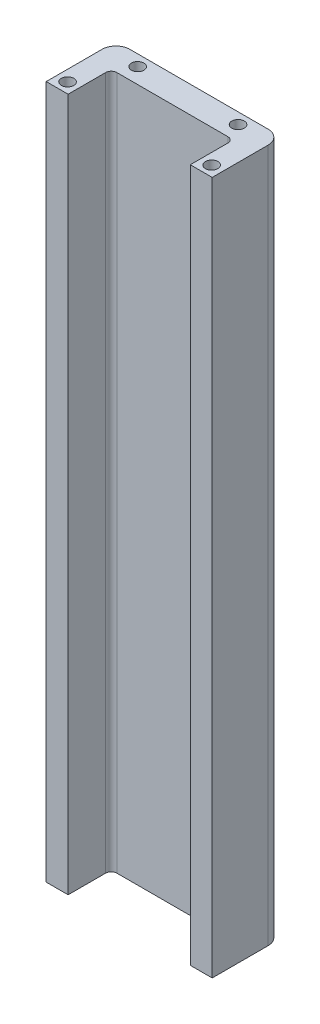
ISO-10303-21;
HEADER;
FILE_DESCRIPTION(('STEP AP214'),'2;1');
FILE_NAME('part.step','',(''),(''),'','','');
FILE_SCHEMA(('AUTOMOTIVE_DESIGN { 1 0 10303 214 1 1 1 1 }'));
ENDSEC;
DATA;
#1=APPLICATION_CONTEXT('core data for automotive mechanical design processes');
#2=APPLICATION_PROTOCOL_DEFINITION('international standard','automotive_design',2000,#1);
#3=PRODUCT_CONTEXT('',#1,'mechanical');
#4=PRODUCT('Part','Part','',(#3));
#5=PRODUCT_RELATED_PRODUCT_CATEGORY('part','',(#4));
#6=PRODUCT_DEFINITION_FORMATION('','',#4);
#7=PRODUCT_DEFINITION_CONTEXT('part definition',#1,'design');
#8=PRODUCT_DEFINITION('design','',#6,#7);
#9=PRODUCT_DEFINITION_SHAPE('','',#8);
#10=(LENGTH_UNIT() NAMED_UNIT(*) SI_UNIT(.MILLI.,.METRE.));
#11=(NAMED_UNIT(*) PLANE_ANGLE_UNIT() SI_UNIT($,.RADIAN.));
#12=(NAMED_UNIT(*) SI_UNIT($,.STERADIAN.) SOLID_ANGLE_UNIT());
#13=UNCERTAINTY_MEASURE_WITH_UNIT(LENGTH_MEASURE(1.E-05),#10,'distance_accuracy_value','');
#14=(GEOMETRIC_REPRESENTATION_CONTEXT(3) GLOBAL_UNCERTAINTY_ASSIGNED_CONTEXT((#13)) GLOBAL_UNIT_ASSIGNED_CONTEXT((#10,
#11,#12)) REPRESENTATION_CONTEXT('',''));
#15=CARTESIAN_POINT('',(0.,0.,0.));
#16=DIRECTION('',(0.,0.,1.));
#17=DIRECTION('',(1.,0.,0.));
#18=AXIS2_PLACEMENT_3D('',#15,#16,#17);
#19=CARTESIAN_POINT('',(29.925,-250.,12.575));
#20=DIRECTION('',(1.,0.,0.));
#21=DIRECTION('',(0.,0.,-1.));
#22=AXIS2_PLACEMENT_3D('',#19,#20,#21);
#23=PLANE('',#22);
#24=DIRECTION('',(0.,0.,-1.));
#25=VECTOR('',#24,1.);
#26=CARTESIAN_POINT('',(29.925,0.,12.575));
#27=LINE('',#26,#25);
#28=CARTESIAN_POINT('',(29.925,0.,12.575));
#29=VERTEX_POINT('',#28);
#30=CARTESIAN_POINT('',(29.925,0.,-7.57499999999996));
#31=VERTEX_POINT('',#30);
#32=EDGE_CURVE('E166',#29,#31,#27,.T.);
#33=ORIENTED_EDGE('',*,*,#32,.F.);
#34=DIRECTION('',(0.,1.,0.));
#35=VECTOR('',#34,1.);
#36=CARTESIAN_POINT('',(29.925,-250.,12.575));
#37=LINE('',#36,#35);
#38=CARTESIAN_POINT('',(29.925,-250.,12.575));
#39=VERTEX_POINT('',#38);
#40=EDGE_CURVE('E11',#39,#29,#37,.T.);
#41=ORIENTED_EDGE('',*,*,#40,.F.);
#42=DIRECTION('',(0.,0.,-1.));
#43=VECTOR('',#42,1.);
#44=CARTESIAN_POINT('',(29.925,-250.,12.575));
#45=LINE('',#44,#43);
#46=CARTESIAN_POINT('',(29.925,-250.,-7.57499999999996));
#47=VERTEX_POINT('',#46);
#48=EDGE_CURVE('E211',#39,#47,#45,.T.);
#49=ORIENTED_EDGE('',*,*,#48,.T.);
#50=DIRECTION('',(0.,1.,0.));
#51=VECTOR('',#50,1.);
#52=CARTESIAN_POINT('',(29.925,-250.,-7.57499999999996));
#53=LINE('',#52,#51);
#54=EDGE_CURVE('E42',#47,#31,#53,.T.);
#55=ORIENTED_EDGE('',*,*,#54,.T.);
#56=EDGE_LOOP('',(#33,#41,#49,#55));
#57=FACE_BOUND('',#56,.T.);
#58=ADVANCED_FACE('F39',(#57),#23,.T.);
#59=CARTESIAN_POINT('',(29.925,-250.,12.575));
#60=DIRECTION('',(0.,0.,1.));
#61=DIRECTION('',(1.,0.,0.));
#62=AXIS2_PLACEMENT_3D('',#59,#60,#61);
#63=PLANE('',#62);
#64=DIRECTION('',(1.,0.,0.));
#65=VECTOR('',#64,1.);
#66=CARTESIAN_POINT('',(29.925,0.,12.575));
#67=LINE('',#66,#65);
#68=CARTESIAN_POINT('',(22.025,0.,12.575));
#69=VERTEX_POINT('',#68);
#70=EDGE_CURVE('E208',#69,#29,#67,.T.);
#71=ORIENTED_EDGE('',*,*,#70,.F.);
#72=DIRECTION('',(0.,1.,0.));
#73=VECTOR('',#72,1.);
#74=CARTESIAN_POINT('',(22.025,-250.,12.575));
#75=LINE('',#74,#73);
#76=CARTESIAN_POINT('',(22.025,-250.,12.575));
#77=VERTEX_POINT('',#76);
#78=EDGE_CURVE('E49',#77,#69,#75,.T.);
#79=ORIENTED_EDGE('',*,*,#78,.F.);
#80=DIRECTION('',(1.,0.,0.));
#81=VECTOR('',#80,1.);
#82=CARTESIAN_POINT('',(29.925,-250.,12.575));
#83=LINE('',#82,#81);
#84=EDGE_CURVE('E152',#77,#39,#83,.T.);
#85=ORIENTED_EDGE('',*,*,#84,.T.);
#86=ORIENTED_EDGE('',*,*,#40,.T.);
#87=EDGE_LOOP('',(#71,#79,#85,#86));
#88=FACE_BOUND('',#87,.T.);
#89=ADVANCED_FACE('F241',(#88),#63,.T.);
#90=CARTESIAN_POINT('',(22.025,-250.,-0.974999999999997));
#91=DIRECTION('',(-1.,0.,0.));
#92=DIRECTION('',(0.,0.,1.));
#93=AXIS2_PLACEMENT_3D('',#90,#91,#92);
#94=PLANE('',#93);
#95=DIRECTION('',(0.,0.,1.));
#96=VECTOR('',#95,1.);
#97=CARTESIAN_POINT('',(22.025,0.,-0.974999999999997));
#98=LINE('',#97,#96);
#99=CARTESIAN_POINT('',(22.025,0.,-0.974999999999997));
#100=VERTEX_POINT('',#99);
#101=EDGE_CURVE('E138',#100,#69,#98,.T.);
#102=ORIENTED_EDGE('',*,*,#101,.F.);
#103=DIRECTION('',(0.,1.,0.));
#104=VECTOR('',#103,1.);
#105=CARTESIAN_POINT('',(22.025,-250.,-0.974999999999997));
#106=LINE('',#105,#104);
#107=CARTESIAN_POINT('',(22.025,-250.,-0.974999999999997));
#108=VERTEX_POINT('',#107);
#109=EDGE_CURVE('E133',#108,#100,#106,.T.);
#110=ORIENTED_EDGE('',*,*,#109,.F.);
#111=DIRECTION('',(0.,0.,1.));
#112=VECTOR('',#111,1.);
#113=CARTESIAN_POINT('',(22.025,-250.,-0.974999999999997));
#114=LINE('',#113,#112);
#115=EDGE_CURVE('E136',#108,#77,#114,.T.);
#116=ORIENTED_EDGE('',*,*,#115,.T.);
#117=ORIENTED_EDGE('',*,*,#78,.T.);
#118=EDGE_LOOP('',(#102,#110,#116,#117));
#119=FACE_BOUND('',#118,.T.);
#120=ADVANCED_FACE('F135',(#119),#94,.T.);
#121=CARTESIAN_POINT('',(20.025,-250.,-0.974999999999997));
#122=DIRECTION('',(0.,1.,0.));
#123=DIRECTION('',(0.,0.,1.));
#124=AXIS2_PLACEMENT_3D('',#121,#122,#123);
#125=CYLINDRICAL_SURFACE('',#124,2.);
#126=CARTESIAN_POINT('',(20.025,0.,-0.974999999999997));
#127=DIRECTION('',(0.,-1.,0.));
#128=DIRECTION('',(0.,0.,1.));
#129=AXIS2_PLACEMENT_3D('',#126,#127,#128);
#130=CIRCLE('',#129,2.);
#131=CARTESIAN_POINT('',(20.025,0.,-2.975));
#132=VERTEX_POINT('',#131);
#133=EDGE_CURVE('E203',#132,#100,#130,.T.);
#134=ORIENTED_EDGE('',*,*,#133,.F.);
#135=DIRECTION('',(0.,1.,0.));
#136=VECTOR('',#135,1.);
#137=CARTESIAN_POINT('',(20.025,-250.,-2.975));
#138=LINE('',#137,#136);
#139=CARTESIAN_POINT('',(20.025,-250.,-2.975));
#140=VERTEX_POINT('',#139);
#141=EDGE_CURVE('E144',#140,#132,#138,.T.);
#142=ORIENTED_EDGE('',*,*,#141,.F.);
#143=CARTESIAN_POINT('',(20.025,-250.,-0.974999999999997));
#144=DIRECTION('',(0.,-1.,0.));
#145=DIRECTION('',(0.,0.,1.));
#146=AXIS2_PLACEMENT_3D('',#143,#144,#145);
#147=CIRCLE('',#146,2.);
#148=EDGE_CURVE('E150',#140,#108,#147,.T.);
#149=ORIENTED_EDGE('',*,*,#148,.T.);
#150=ORIENTED_EDGE('',*,*,#109,.T.);
#151=EDGE_LOOP('',(#134,#142,#149,#150));
#152=FACE_BOUND('',#151,.T.);
#153=ADVANCED_FACE('F155',(#152),#125,.F.);
#154=CARTESIAN_POINT('',(-20.025,-250.,-2.975));
#155=DIRECTION('',(0.,0.,1.));
#156=DIRECTION('',(1.,0.,0.));
#157=AXIS2_PLACEMENT_3D('',#154,#155,#156);
#158=PLANE('',#157);
#159=DIRECTION('',(1.,0.,0.));
#160=VECTOR('',#159,1.);
#161=CARTESIAN_POINT('',(-20.025,0.,-2.975));
#162=LINE('',#161,#160);
#163=CARTESIAN_POINT('',(-20.025,0.,-2.975));
#164=VERTEX_POINT('',#163);
#165=EDGE_CURVE('E199',#164,#132,#162,.T.);
#166=ORIENTED_EDGE('',*,*,#165,.F.);
#167=DIRECTION('',(0.,1.,0.));
#168=VECTOR('',#167,1.);
#169=CARTESIAN_POINT('',(-20.025,-250.,-2.975));
#170=LINE('',#169,#168);
#171=CARTESIAN_POINT('',(-20.025,-250.,-2.975));
#172=VERTEX_POINT('',#171);
#173=EDGE_CURVE('E217',#172,#164,#170,.T.);
#174=ORIENTED_EDGE('',*,*,#173,.F.);
#175=DIRECTION('',(1.,0.,0.));
#176=VECTOR('',#175,1.);
#177=CARTESIAN_POINT('',(-20.025,-250.,-2.975));
#178=LINE('',#177,#176);
#179=EDGE_CURVE('E157',#172,#140,#178,.T.);
#180=ORIENTED_EDGE('',*,*,#179,.T.);
#181=ORIENTED_EDGE('',*,*,#141,.T.);
#182=EDGE_LOOP('',(#166,#174,#180,#181));
#183=FACE_BOUND('',#182,.T.);
#184=ADVANCED_FACE('F254',(#183),#158,.T.);
#185=CARTESIAN_POINT('',(-20.025,-250.,-0.974999999999997));
#186=DIRECTION('',(0.,1.,0.));
#187=DIRECTION('',(0.,0.,1.));
#188=AXIS2_PLACEMENT_3D('',#185,#186,#187);
#189=CYLINDRICAL_SURFACE('',#188,2.);
#190=CARTESIAN_POINT('',(-20.025,0.,-0.974999999999997));
#191=DIRECTION('',(0.,-1.,0.));
#192=DIRECTION('',(0.,0.,1.));
#193=AXIS2_PLACEMENT_3D('',#190,#191,#192);
#194=CIRCLE('',#193,2.);
#195=CARTESIAN_POINT('',(-22.025,0.,-0.974999999999997));
#196=VERTEX_POINT('',#195);
#197=EDGE_CURVE('E195',#196,#164,#194,.T.);
#198=ORIENTED_EDGE('',*,*,#197,.F.);
#199=DIRECTION('',(0.,1.,0.));
#200=VECTOR('',#199,1.);
#201=CARTESIAN_POINT('',(-22.025,-250.,-0.974999999999997));
#202=LINE('',#201,#200);
#203=CARTESIAN_POINT('',(-22.025,-250.,-0.974999999999997));
#204=VERTEX_POINT('',#203);
#205=EDGE_CURVE('E220',#204,#196,#202,.T.);
#206=ORIENTED_EDGE('',*,*,#205,.F.);
#207=CARTESIAN_POINT('',(-20.025,-250.,-0.974999999999997));
#208=DIRECTION('',(0.,-1.,0.));
#209=DIRECTION('',(0.,0.,1.));
#210=AXIS2_PLACEMENT_3D('',#207,#208,#209);
#211=CIRCLE('',#210,2.);
#212=EDGE_CURVE('E160',#204,#172,#211,.T.);
#213=ORIENTED_EDGE('',*,*,#212,.T.);
#214=ORIENTED_EDGE('',*,*,#173,.T.);
#215=EDGE_LOOP('',(#198,#206,#213,#214));
#216=FACE_BOUND('',#215,.T.);
#217=ADVANCED_FACE('F257',(#216),#189,.F.);
#218=CARTESIAN_POINT('',(-22.025,-250.,12.575));
#219=DIRECTION('',(1.,0.,0.));
#220=DIRECTION('',(0.,0.,-1.));
#221=AXIS2_PLACEMENT_3D('',#218,#219,#220);
#222=PLANE('',#221);
#223=DIRECTION('',(0.,0.,-1.));
#224=VECTOR('',#223,1.);
#225=CARTESIAN_POINT('',(-22.025,0.,12.575));
#226=LINE('',#225,#224);
#227=CARTESIAN_POINT('',(-22.025,0.,12.575));
#228=VERTEX_POINT('',#227);
#229=EDGE_CURVE('E191',#228,#196,#226,.T.);
#230=ORIENTED_EDGE('',*,*,#229,.F.);
#231=DIRECTION('',(0.,1.,0.));
#232=VECTOR('',#231,1.);
#233=CARTESIAN_POINT('',(-22.025,-250.,12.575));
#234=LINE('',#233,#232);
#235=CARTESIAN_POINT('',(-22.025,-250.,12.575));
#236=VERTEX_POINT('',#235);
#237=EDGE_CURVE('E223',#236,#228,#234,.T.);
#238=ORIENTED_EDGE('',*,*,#237,.F.);
#239=DIRECTION('',(0.,0.,-1.));
#240=VECTOR('',#239,1.);
#241=CARTESIAN_POINT('',(-22.025,-250.,12.575));
#242=LINE('',#241,#240);
#243=EDGE_CURVE('E365',#236,#204,#242,.T.);
#244=ORIENTED_EDGE('',*,*,#243,.T.);
#245=ORIENTED_EDGE('',*,*,#205,.T.);
#246=EDGE_LOOP('',(#230,#238,#244,#245));
#247=FACE_BOUND('',#246,.T.);
#248=ADVANCED_FACE('F261',(#247),#222,.T.);
#249=CARTESIAN_POINT('',(-22.025,-250.,12.575));
#250=DIRECTION('',(0.,0.,1.));
#251=DIRECTION('',(1.,0.,0.));
#252=AXIS2_PLACEMENT_3D('',#249,#250,#251);
#253=PLANE('',#252);
#254=DIRECTION('',(1.,0.,0.));
#255=VECTOR('',#254,1.);
#256=CARTESIAN_POINT('',(-22.025,0.,12.575));
#257=LINE('',#256,#255);
#258=CARTESIAN_POINT('',(-29.925,0.,12.575));
#259=VERTEX_POINT('',#258);
#260=EDGE_CURVE('E187',#259,#228,#257,.T.);
#261=ORIENTED_EDGE('',*,*,#260,.F.);
#262=DIRECTION('',(0.,1.,0.));
#263=VECTOR('',#262,1.);
#264=CARTESIAN_POINT('',(-29.925,-250.,12.575));
#265=LINE('',#264,#263);
#266=CARTESIAN_POINT('',(-29.925,-250.,12.575));
#267=VERTEX_POINT('',#266);
#268=EDGE_CURVE('E226',#267,#259,#265,.T.);
#269=ORIENTED_EDGE('',*,*,#268,.F.);
#270=DIRECTION('',(1.,0.,0.));
#271=VECTOR('',#270,1.);
#272=CARTESIAN_POINT('',(-22.025,-250.,12.575));
#273=LINE('',#272,#271);
#274=EDGE_CURVE('E361',#267,#236,#273,.T.);
#275=ORIENTED_EDGE('',*,*,#274,.T.);
#276=ORIENTED_EDGE('',*,*,#237,.T.);
#277=EDGE_LOOP('',(#261,#269,#275,#276));
#278=FACE_BOUND('',#277,.T.);
#279=ADVANCED_FACE('F265',(#278),#253,.T.);
#280=CARTESIAN_POINT('',(-29.925,-250.,12.575));
#281=DIRECTION('',(-1.,0.,0.));
#282=DIRECTION('',(0.,0.,1.));
#283=AXIS2_PLACEMENT_3D('',#280,#281,#282);
#284=PLANE('',#283);
#285=DIRECTION('',(0.,0.,1.));
#286=VECTOR('',#285,1.);
#287=CARTESIAN_POINT('',(-29.925,0.,12.575));
#288=LINE('',#287,#286);
#289=CARTESIAN_POINT('',(-29.925,0.,-7.57499999999996));
#290=VERTEX_POINT('',#289);
#291=EDGE_CURVE('E183',#290,#259,#288,.T.);
#292=ORIENTED_EDGE('',*,*,#291,.F.);
#293=DIRECTION('',(0.,1.,0.));
#294=VECTOR('',#293,1.);
#295=CARTESIAN_POINT('',(-29.925,-250.,-7.57499999999996));
#296=LINE('',#295,#294);
#297=CARTESIAN_POINT('',(-29.925,-250.,-7.57499999999996));
#298=VERTEX_POINT('',#297);
#299=EDGE_CURVE('E229',#298,#290,#296,.T.);
#300=ORIENTED_EDGE('',*,*,#299,.F.);
#301=DIRECTION('',(0.,0.,1.));
#302=VECTOR('',#301,1.);
#303=CARTESIAN_POINT('',(-29.925,-250.,12.575));
#304=LINE('',#303,#302);
#305=EDGE_CURVE('E357',#298,#267,#304,.T.);
#306=ORIENTED_EDGE('',*,*,#305,.T.);
#307=ORIENTED_EDGE('',*,*,#268,.T.);
#308=EDGE_LOOP('',(#292,#300,#306,#307));
#309=FACE_BOUND('',#308,.T.);
#310=ADVANCED_FACE('F269',(#309),#284,.T.);
#311=CARTESIAN_POINT('',(-24.925,-250.,-7.575));
#312=DIRECTION('',(0.,1.,0.));
#313=DIRECTION('',(0.,0.,1.));
#314=AXIS2_PLACEMENT_3D('',#311,#312,#313);
#315=CYLINDRICAL_SURFACE('',#314,5.);
#316=CARTESIAN_POINT('',(-24.925,0.,-7.575));
#317=DIRECTION('',(0.,1.,0.));
#318=DIRECTION('',(0.,0.,1.));
#319=AXIS2_PLACEMENT_3D('',#316,#317,#318);
#320=CIRCLE('',#319,5.);
#321=CARTESIAN_POINT('',(-24.925,0.,-12.575));
#322=VERTEX_POINT('',#321);
#323=EDGE_CURVE('E179',#322,#290,#320,.T.);
#324=ORIENTED_EDGE('',*,*,#323,.F.);
#325=DIRECTION('',(0.,1.,0.));
#326=VECTOR('',#325,1.);
#327=CARTESIAN_POINT('',(-24.925,-250.,-12.575));
#328=LINE('',#327,#326);
#329=CARTESIAN_POINT('',(-24.925,-250.,-12.575));
#330=VERTEX_POINT('',#329);
#331=EDGE_CURVE('E232',#330,#322,#328,.T.);
#332=ORIENTED_EDGE('',*,*,#331,.F.);
#333=CARTESIAN_POINT('',(-24.925,-250.,-7.575));
#334=DIRECTION('',(0.,1.,0.));
#335=DIRECTION('',(0.,0.,1.));
#336=AXIS2_PLACEMENT_3D('',#333,#334,#335);
#337=CIRCLE('',#336,5.);
#338=EDGE_CURVE('E353',#330,#298,#337,.T.);
#339=ORIENTED_EDGE('',*,*,#338,.T.);
#340=ORIENTED_EDGE('',*,*,#299,.T.);
#341=EDGE_LOOP('',(#324,#332,#339,#340));
#342=FACE_BOUND('',#341,.T.);
#343=ADVANCED_FACE('F273',(#342),#315,.T.);
#344=CARTESIAN_POINT('',(24.925,-250.,-12.575));
#345=DIRECTION('',(0.,0.,-1.));
#346=DIRECTION('',(-1.,0.,0.));
#347=AXIS2_PLACEMENT_3D('',#344,#345,#346);
#348=PLANE('',#347);
#349=DIRECTION('',(-1.,0.,0.));
#350=VECTOR('',#349,1.);
#351=CARTESIAN_POINT('',(24.925,0.,-12.575));
#352=LINE('',#351,#350);
#353=CARTESIAN_POINT('',(24.925,0.,-12.575));
#354=VERTEX_POINT('',#353);
#355=EDGE_CURVE('E175',#354,#322,#352,.T.);
#356=ORIENTED_EDGE('',*,*,#355,.F.);
#357=DIRECTION('',(0.,1.,0.));
#358=VECTOR('',#357,1.);
#359=CARTESIAN_POINT('',(24.925,-250.,-12.575));
#360=LINE('',#359,#358);
#361=CARTESIAN_POINT('',(24.925,-250.,-12.575));
#362=VERTEX_POINT('',#361);
#363=EDGE_CURVE('E234',#362,#354,#360,.T.);
#364=ORIENTED_EDGE('',*,*,#363,.F.);
#365=DIRECTION('',(-1.,0.,0.));
#366=VECTOR('',#365,1.);
#367=CARTESIAN_POINT('',(24.925,-250.,-12.575));
#368=LINE('',#367,#366);
#369=EDGE_CURVE('E349',#362,#330,#368,.T.);
#370=ORIENTED_EDGE('',*,*,#369,.T.);
#371=ORIENTED_EDGE('',*,*,#331,.T.);
#372=EDGE_LOOP('',(#356,#364,#370,#371));
#373=FACE_BOUND('',#372,.T.);
#374=ADVANCED_FACE('F277',(#373),#348,.T.);
#375=CARTESIAN_POINT('',(24.925,-250.,-7.575));
#376=DIRECTION('',(0.,1.,0.));
#377=DIRECTION('',(0.,0.,1.));
#378=AXIS2_PLACEMENT_3D('',#375,#376,#377);
#379=CYLINDRICAL_SURFACE('',#378,5.);
#380=CARTESIAN_POINT('',(24.925,0.,-7.575));
#381=DIRECTION('',(0.,1.,0.));
#382=DIRECTION('',(0.,0.,-1.));
#383=AXIS2_PLACEMENT_3D('',#380,#381,#382);
#384=CIRCLE('',#383,5.);
#385=EDGE_CURVE('E170',#31,#354,#384,.T.);
#386=ORIENTED_EDGE('',*,*,#385,.F.);
#387=ORIENTED_EDGE('',*,*,#54,.F.);
#388=CARTESIAN_POINT('',(24.925,-250.,-7.575));
#389=DIRECTION('',(0.,1.,0.));
#390=DIRECTION('',(0.,0.,-1.));
#391=AXIS2_PLACEMENT_3D('',#388,#389,#390);
#392=CIRCLE('',#391,5.);
#393=EDGE_CURVE('E346',#47,#362,#392,.T.);
#394=ORIENTED_EDGE('',*,*,#393,.T.);
#395=ORIENTED_EDGE('',*,*,#363,.T.);
#396=EDGE_LOOP('',(#386,#387,#394,#395));
#397=FACE_BOUND('',#396,.T.);
#398=ADVANCED_FACE('F238',(#397),#379,.T.);
#399=CARTESIAN_POINT('',(24.925,-250.,-7.575));
#400=DIRECTION('',(0.,-1.,0.));
#401=DIRECTION('',(0.,0.,-1.));
#402=AXIS2_PLACEMENT_3D('',#399,#400,#401);
#403=PLANE('',#402);
#404=CARTESIAN_POINT('',(-18.1,-250.,-8.57499999999999));
#405=DIRECTION('',(0.,1.,0.));
#406=DIRECTION('',(0.,0.,-1.));
#407=AXIS2_PLACEMENT_3D('',#404,#405,#406);
#408=CIRCLE('',#407,2.25);
#409=CARTESIAN_POINT('',(-18.1,-250.,-10.825));
#410=VERTEX_POINT('',#409);
#411=EDGE_CURVE('E312',#410,#410,#408,.T.);
#412=ORIENTED_EDGE('',*,*,#411,.T.);
#413=EDGE_LOOP('',(#412));
#414=FACE_BOUND('',#413,.T.);
#415=CARTESIAN_POINT('',(-25.975,-250.,8.825));
#416=DIRECTION('',(0.,1.,0.));
#417=DIRECTION('',(0.,0.,-1.));
#418=AXIS2_PLACEMENT_3D('',#415,#416,#417);
#419=CIRCLE('',#418,2.25);
#420=CARTESIAN_POINT('',(-25.975,-250.,6.575));
#421=VERTEX_POINT('',#420);
#422=EDGE_CURVE('E322',#421,#421,#419,.T.);
#423=ORIENTED_EDGE('',*,*,#422,.T.);
#424=EDGE_LOOP('',(#423));
#425=FACE_BOUND('',#424,.T.);
#426=CARTESIAN_POINT('',(25.975,-250.,8.825));
#427=DIRECTION('',(0.,1.,0.));
#428=DIRECTION('',(0.,0.,1.));
#429=AXIS2_PLACEMENT_3D('',#426,#427,#428);
#430=CIRCLE('',#429,2.25);
#431=CARTESIAN_POINT('',(25.975,-250.,11.075));
#432=VERTEX_POINT('',#431);
#433=EDGE_CURVE('E330',#432,#432,#430,.T.);
#434=ORIENTED_EDGE('',*,*,#433,.T.);
#435=EDGE_LOOP('',(#434));
#436=FACE_BOUND('',#435,.T.);
#437=CARTESIAN_POINT('',(18.1,-250.,-8.575));
#438=DIRECTION('',(0.,1.,0.));
#439=DIRECTION('',(0.,0.,1.));
#440=AXIS2_PLACEMENT_3D('',#437,#438,#439);
#441=CIRCLE('',#440,2.25);
#442=CARTESIAN_POINT('',(18.1,-250.,-6.325));
#443=VERTEX_POINT('',#442);
#444=EDGE_CURVE('E171',#443,#443,#441,.T.);
#445=ORIENTED_EDGE('',*,*,#444,.T.);
#446=EDGE_LOOP('',(#445));
#447=FACE_BOUND('',#446,.T.);
#448=ORIENTED_EDGE('',*,*,#48,.F.);
#449=ORIENTED_EDGE('',*,*,#84,.F.);
#450=ORIENTED_EDGE('',*,*,#115,.F.);
#451=ORIENTED_EDGE('',*,*,#148,.F.);
#452=ORIENTED_EDGE('',*,*,#179,.F.);
#453=ORIENTED_EDGE('',*,*,#212,.F.);
#454=ORIENTED_EDGE('',*,*,#243,.F.);
#455=ORIENTED_EDGE('',*,*,#274,.F.);
#456=ORIENTED_EDGE('',*,*,#305,.F.);
#457=ORIENTED_EDGE('',*,*,#338,.F.);
#458=ORIENTED_EDGE('',*,*,#369,.F.);
#459=ORIENTED_EDGE('',*,*,#393,.F.);
#460=EDGE_LOOP('',(#448,#449,#450,#451,#452,#453,#454,#455,#456,#457,#458,#459));
#461=FACE_BOUND('',#460,.T.);
#462=ADVANCED_FACE('F148',(#414,#425,#436,#447,#461),#403,.T.);
#463=CARTESIAN_POINT('',(24.925,0.,-7.575));
#464=DIRECTION('',(0.,-1.,0.));
#465=DIRECTION('',(0.,0.,-1.));
#466=AXIS2_PLACEMENT_3D('',#463,#464,#465);
#467=PLANE('',#466);
#468=CARTESIAN_POINT('',(-18.1,0.,-8.57499999999999));
#469=DIRECTION('',(0.,1.,0.));
#470=DIRECTION('',(0.,0.,-1.));
#471=AXIS2_PLACEMENT_3D('',#468,#469,#470);
#472=CIRCLE('',#471,2.25);
#473=CARTESIAN_POINT('',(-18.1,0.,-10.825));
#474=VERTEX_POINT('',#473);
#475=EDGE_CURVE('E315',#474,#474,#472,.T.);
#476=ORIENTED_EDGE('',*,*,#475,.F.);
#477=EDGE_LOOP('',(#476));
#478=FACE_BOUND('',#477,.T.);
#479=CARTESIAN_POINT('',(-25.975,0.,8.825));
#480=DIRECTION('',(0.,1.,0.));
#481=DIRECTION('',(0.,0.,-1.));
#482=AXIS2_PLACEMENT_3D('',#479,#480,#481);
#483=CIRCLE('',#482,2.25);
#484=CARTESIAN_POINT('',(-25.975,0.,6.575));
#485=VERTEX_POINT('',#484);
#486=EDGE_CURVE('E319',#485,#485,#483,.T.);
#487=ORIENTED_EDGE('',*,*,#486,.F.);
#488=EDGE_LOOP('',(#487));
#489=FACE_BOUND('',#488,.T.);
#490=CARTESIAN_POINT('',(25.975,0.,8.825));
#491=DIRECTION('',(0.,1.,0.));
#492=DIRECTION('',(0.,0.,1.));
#493=AXIS2_PLACEMENT_3D('',#490,#491,#492);
#494=CIRCLE('',#493,2.25);
#495=CARTESIAN_POINT('',(25.975,0.,11.075));
#496=VERTEX_POINT('',#495);
#497=EDGE_CURVE('E326',#496,#496,#494,.T.);
#498=ORIENTED_EDGE('',*,*,#497,.F.);
#499=EDGE_LOOP('',(#498));
#500=FACE_BOUND('',#499,.T.);
#501=CARTESIAN_POINT('',(18.1,0.,-8.575));
#502=DIRECTION('',(0.,1.,0.));
#503=DIRECTION('',(0.,0.,1.));
#504=AXIS2_PLACEMENT_3D('',#501,#502,#503);
#505=CIRCLE('',#504,2.25);
#506=CARTESIAN_POINT('',(18.1,0.,-6.325));
#507=VERTEX_POINT('',#506);
#508=EDGE_CURVE('E334',#507,#507,#505,.T.);
#509=ORIENTED_EDGE('',*,*,#508,.F.);
#510=EDGE_LOOP('',(#509));
#511=FACE_BOUND('',#510,.T.);
#512=ORIENTED_EDGE('',*,*,#32,.T.);
#513=ORIENTED_EDGE('',*,*,#385,.T.);
#514=ORIENTED_EDGE('',*,*,#355,.T.);
#515=ORIENTED_EDGE('',*,*,#323,.T.);
#516=ORIENTED_EDGE('',*,*,#291,.T.);
#517=ORIENTED_EDGE('',*,*,#260,.T.);
#518=ORIENTED_EDGE('',*,*,#229,.T.);
#519=ORIENTED_EDGE('',*,*,#197,.T.);
#520=ORIENTED_EDGE('',*,*,#165,.T.);
#521=ORIENTED_EDGE('',*,*,#133,.T.);
#522=ORIENTED_EDGE('',*,*,#101,.T.);
#523=ORIENTED_EDGE('',*,*,#70,.T.);
#524=EDGE_LOOP('',(#512,#513,#514,#515,#516,#517,#518,#519,#520,#521,#522,#523));
#525=FACE_BOUND('',#524,.T.);
#526=ADVANCED_FACE('F240',(#478,#489,#500,#511,#525),#467,.F.);
#527=CARTESIAN_POINT('',(18.1,-250.,-8.575));
#528=DIRECTION('',(0.,1.,0.));
#529=DIRECTION('',(0.,0.,1.));
#530=AXIS2_PLACEMENT_3D('',#527,#528,#529);
#531=CYLINDRICAL_SURFACE('',#530,2.25);
#532=ORIENTED_EDGE('',*,*,#444,.F.);
#533=EDGE_LOOP('',(#532));
#534=FACE_BOUND('',#533,.T.);
#535=ORIENTED_EDGE('',*,*,#508,.T.);
#536=EDGE_LOOP('',(#535));
#537=FACE_BOUND('',#536,.T.);
#538=ADVANCED_FACE('F289',(#534,#537),#531,.F.);
#539=CARTESIAN_POINT('',(25.975,-250.,8.825));
#540=DIRECTION('',(0.,1.,0.));
#541=DIRECTION('',(0.,0.,1.));
#542=AXIS2_PLACEMENT_3D('',#539,#540,#541);
#543=CYLINDRICAL_SURFACE('',#542,2.25);
#544=ORIENTED_EDGE('',*,*,#433,.F.);
#545=EDGE_LOOP('',(#544));
#546=FACE_BOUND('',#545,.T.);
#547=ORIENTED_EDGE('',*,*,#497,.T.);
#548=EDGE_LOOP('',(#547));
#549=FACE_BOUND('',#548,.T.);
#550=ADVANCED_FACE('F296',(#546,#549),#543,.F.);
#551=CARTESIAN_POINT('',(-25.975,-250.,8.825));
#552=DIRECTION('',(0.,1.,0.));
#553=DIRECTION('',(0.,0.,1.));
#554=AXIS2_PLACEMENT_3D('',#551,#552,#553);
#555=CYLINDRICAL_SURFACE('',#554,2.25);
#556=ORIENTED_EDGE('',*,*,#422,.F.);
#557=EDGE_LOOP('',(#556));
#558=FACE_BOUND('',#557,.T.);
#559=ORIENTED_EDGE('',*,*,#486,.T.);
#560=EDGE_LOOP('',(#559));
#561=FACE_BOUND('',#560,.T.);
#562=ADVANCED_FACE('F300',(#558,#561),#555,.F.);
#563=CARTESIAN_POINT('',(-18.1,-250.,-8.57499999999999));
#564=DIRECTION('',(0.,1.,0.));
#565=DIRECTION('',(0.,0.,1.));
#566=AXIS2_PLACEMENT_3D('',#563,#564,#565);
#567=CYLINDRICAL_SURFACE('',#566,2.25);
#568=ORIENTED_EDGE('',*,*,#411,.F.);
#569=EDGE_LOOP('',(#568));
#570=FACE_BOUND('',#569,.T.);
#571=ORIENTED_EDGE('',*,*,#475,.T.);
#572=EDGE_LOOP('',(#571));
#573=FACE_BOUND('',#572,.T.);
#574=ADVANCED_FACE('F304',(#570,#573),#567,.F.);
#575=CLOSED_SHELL('',(#58,#89,#120,#153,#184,#217,#248,#279,#310,#343,#374,#398,#462,#526,#538,
#550,#562,#574));
#576=MANIFOLD_SOLID_BREP('B2',#575);
#577=ADVANCED_BREP_SHAPE_REPRESENTATION('',(#18,#576),#14);
#578=SHAPE_DEFINITION_REPRESENTATION(#9,#577);
ENDSEC;
END-ISO-10303-21;
